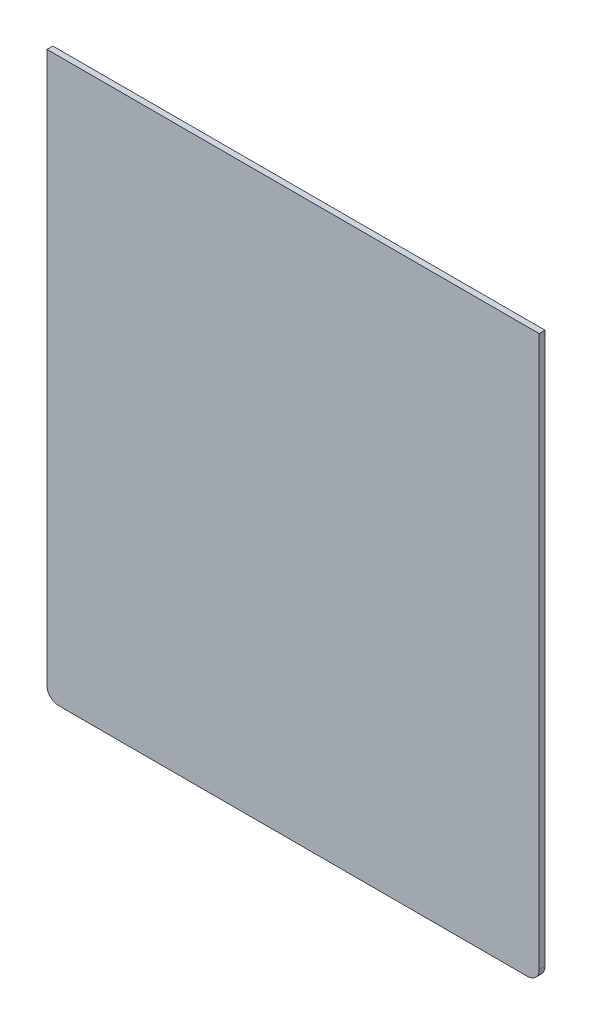
ISO-10303-21;
HEADER;
FILE_DESCRIPTION(('STEP AP214'),'2;1');
FILE_NAME('part.step','',(''),(''),'','','');
FILE_SCHEMA(('AUTOMOTIVE_DESIGN { 1 0 10303 214 1 1 1 1 }'));
ENDSEC;
DATA;
#1=APPLICATION_CONTEXT('core data for automotive mechanical design processes');
#2=APPLICATION_PROTOCOL_DEFINITION('international standard','automotive_design',2000,#1);
#3=PRODUCT_CONTEXT('',#1,'mechanical');
#4=PRODUCT('Part','Part','',(#3));
#5=PRODUCT_RELATED_PRODUCT_CATEGORY('part','',(#4));
#6=PRODUCT_DEFINITION_FORMATION('','',#4);
#7=PRODUCT_DEFINITION_CONTEXT('part definition',#1,'design');
#8=PRODUCT_DEFINITION('design','',#6,#7);
#9=PRODUCT_DEFINITION_SHAPE('','',#8);
#10=(LENGTH_UNIT() NAMED_UNIT(*) SI_UNIT(.MILLI.,.METRE.));
#11=(NAMED_UNIT(*) PLANE_ANGLE_UNIT() SI_UNIT($,.RADIAN.));
#12=(NAMED_UNIT(*) SI_UNIT($,.STERADIAN.) SOLID_ANGLE_UNIT());
#13=UNCERTAINTY_MEASURE_WITH_UNIT(LENGTH_MEASURE(1.E-05),#10,'distance_accuracy_value','');
#14=(GEOMETRIC_REPRESENTATION_CONTEXT(3) GLOBAL_UNCERTAINTY_ASSIGNED_CONTEXT((#13)) GLOBAL_UNIT_ASSIGNED_CONTEXT((#10,
#11,#12)) REPRESENTATION_CONTEXT('',''));
#15=CARTESIAN_POINT('',(0.,0.,0.));
#16=DIRECTION('',(0.,0.,1.));
#17=DIRECTION('',(1.,0.,0.));
#18=AXIS2_PLACEMENT_3D('',#15,#16,#17);
#19=CARTESIAN_POINT('',(210.,-240.,5.));
#20=DIRECTION('',(-1.,0.,0.));
#21=DIRECTION('',(0.,0.,1.));
#22=AXIS2_PLACEMENT_3D('',#19,#20,#21);
#23=PLANE('',#22);
#24=DIRECTION('',(0.,1.,0.));
#25=VECTOR('',#24,1.);
#26=CARTESIAN_POINT('',(210.,-240.,5.));
#27=LINE('',#26,#25);
#28=CARTESIAN_POINT('',(210.,-230.,5.));
#29=VERTEX_POINT('',#28);
#30=CARTESIAN_POINT('',(210.,240.,5.));
#31=VERTEX_POINT('',#30);
#32=EDGE_CURVE('E93',#29,#31,#27,.T.);
#33=ORIENTED_EDGE('',*,*,#32,.F.);
#34=DIRECTION('',(0.,0.,-1.));
#35=VECTOR('',#34,1.);
#36=CARTESIAN_POINT('',(210.,-230.,5.));
#37=LINE('',#36,#35);
#38=CARTESIAN_POINT('',(210.,-230.,0.));
#39=VERTEX_POINT('',#38);
#40=EDGE_CURVE('E11',#29,#39,#37,.T.);
#41=ORIENTED_EDGE('',*,*,#40,.T.);
#42=DIRECTION('',(0.,1.,0.));
#43=VECTOR('',#42,1.);
#44=CARTESIAN_POINT('',(210.,-240.,0.));
#45=LINE('',#44,#43);
#46=CARTESIAN_POINT('',(210.,240.,0.));
#47=VERTEX_POINT('',#46);
#48=EDGE_CURVE('E114',#39,#47,#45,.T.);
#49=ORIENTED_EDGE('',*,*,#48,.T.);
#50=DIRECTION('',(0.,0.,-1.));
#51=VECTOR('',#50,1.);
#52=CARTESIAN_POINT('',(210.,240.,5.));
#53=LINE('',#52,#51);
#54=EDGE_CURVE('E107',#31,#47,#53,.T.);
#55=ORIENTED_EDGE('',*,*,#54,.F.);
#56=EDGE_LOOP('',(#33,#41,#49,#55));
#57=FACE_BOUND('',#56,.T.);
#58=ADVANCED_FACE('F39',(#57),#23,.F.);
#59=CARTESIAN_POINT('',(-210.,240.,5.));
#60=DIRECTION('',(0.,-1.,0.));
#61=DIRECTION('',(0.,0.,-1.));
#62=AXIS2_PLACEMENT_3D('',#59,#60,#61);
#63=PLANE('',#62);
#64=DIRECTION('',(-1.,0.,0.));
#65=VECTOR('',#64,1.);
#66=CARTESIAN_POINT('',(-210.,240.,0.));
#67=LINE('',#66,#65);
#68=CARTESIAN_POINT('',(-210.,240.,0.));
#69=VERTEX_POINT('',#68);
#70=EDGE_CURVE('E158',#47,#69,#67,.T.);
#71=ORIENTED_EDGE('',*,*,#70,.T.);
#72=DIRECTION('',(0.,0.,-1.));
#73=VECTOR('',#72,1.);
#74=CARTESIAN_POINT('',(-210.,240.,5.));
#75=LINE('',#74,#73);
#76=CARTESIAN_POINT('',(-210.,240.,5.));
#77=VERTEX_POINT('',#76);
#78=EDGE_CURVE('E109',#77,#69,#75,.T.);
#79=ORIENTED_EDGE('',*,*,#78,.F.);
#80=DIRECTION('',(-1.,0.,0.));
#81=VECTOR('',#80,1.);
#82=CARTESIAN_POINT('',(-210.,240.,5.));
#83=LINE('',#82,#81);
#84=EDGE_CURVE('E96',#31,#77,#83,.T.);
#85=ORIENTED_EDGE('',*,*,#84,.F.);
#86=ORIENTED_EDGE('',*,*,#54,.T.);
#87=EDGE_LOOP('',(#71,#79,#85,#86));
#88=FACE_BOUND('',#87,.T.);
#89=ADVANCED_FACE('F106',(#88),#63,.F.);
#90=CARTESIAN_POINT('',(-210.,-240.,5.));
#91=DIRECTION('',(1.,0.,0.));
#92=DIRECTION('',(0.,0.,-1.));
#93=AXIS2_PLACEMENT_3D('',#90,#91,#92);
#94=PLANE('',#93);
#95=DIRECTION('',(0.,-1.,0.));
#96=VECTOR('',#95,1.);
#97=CARTESIAN_POINT('',(-210.,-240.,0.));
#98=LINE('',#97,#96);
#99=CARTESIAN_POINT('',(-210.,-230.,0.));
#100=VERTEX_POINT('',#99);
#101=EDGE_CURVE('E155',#69,#100,#98,.T.);
#102=ORIENTED_EDGE('',*,*,#101,.T.);
#103=DIRECTION('',(0.,0.,-1.));
#104=VECTOR('',#103,1.);
#105=CARTESIAN_POINT('',(-210.,-230.,5.));
#106=LINE('',#105,#104);
#107=CARTESIAN_POINT('',(-210.,-230.,5.));
#108=VERTEX_POINT('',#107);
#109=EDGE_CURVE('E63',#100,#108,#106,.F.);
#110=ORIENTED_EDGE('',*,*,#109,.T.);
#111=DIRECTION('',(0.,-1.,0.));
#112=VECTOR('',#111,1.);
#113=CARTESIAN_POINT('',(-210.,-240.,5.));
#114=LINE('',#113,#112);
#115=EDGE_CURVE('E111',#77,#108,#114,.T.);
#116=ORIENTED_EDGE('',*,*,#115,.F.);
#117=ORIENTED_EDGE('',*,*,#78,.T.);
#118=EDGE_LOOP('',(#102,#110,#116,#117));
#119=FACE_BOUND('',#118,.T.);
#120=ADVANCED_FACE('F156',(#119),#94,.F.);
#121=CARTESIAN_POINT('',(-210.,-240.,5.));
#122=DIRECTION('',(0.,1.,0.));
#123=DIRECTION('',(0.,0.,1.));
#124=AXIS2_PLACEMENT_3D('',#121,#122,#123);
#125=PLANE('',#124);
#126=DIRECTION('',(1.,0.,0.));
#127=VECTOR('',#126,1.);
#128=CARTESIAN_POINT('',(-210.,-240.,5.));
#129=LINE('',#128,#127);
#130=CARTESIAN_POINT('',(-200.,-240.,5.));
#131=VERTEX_POINT('',#130);
#132=CARTESIAN_POINT('',(200.,-240.,5.));
#133=VERTEX_POINT('',#132);
#134=EDGE_CURVE('E123',#131,#133,#129,.T.);
#135=ORIENTED_EDGE('',*,*,#134,.F.);
#136=DIRECTION('',(0.,0.,-1.));
#137=VECTOR('',#136,1.);
#138=CARTESIAN_POINT('',(-200.,-240.,5.));
#139=LINE('',#138,#137);
#140=CARTESIAN_POINT('',(-200.,-240.,0.));
#141=VERTEX_POINT('',#140);
#142=EDGE_CURVE('E121',#131,#141,#139,.T.);
#143=ORIENTED_EDGE('',*,*,#142,.T.);
#144=DIRECTION('',(1.,0.,0.));
#145=VECTOR('',#144,1.);
#146=CARTESIAN_POINT('',(-210.,-240.,0.));
#147=LINE('',#146,#145);
#148=CARTESIAN_POINT('',(200.,-240.,0.));
#149=VERTEX_POINT('',#148);
#150=EDGE_CURVE('E102',#141,#149,#147,.T.);
#151=ORIENTED_EDGE('',*,*,#150,.T.);
#152=DIRECTION('',(0.,0.,-1.));
#153=VECTOR('',#152,1.);
#154=CARTESIAN_POINT('',(200.,-240.,5.));
#155=LINE('',#154,#153);
#156=EDGE_CURVE('E117',#149,#133,#155,.F.);
#157=ORIENTED_EDGE('',*,*,#156,.T.);
#158=EDGE_LOOP('',(#135,#143,#151,#157));
#159=FACE_BOUND('',#158,.T.);
#160=ADVANCED_FACE('F145',(#159),#125,.F.);
#161=CARTESIAN_POINT('',(0.,0.,5.));
#162=DIRECTION('',(0.,0.,-1.));
#163=DIRECTION('',(-1.,0.,0.));
#164=AXIS2_PLACEMENT_3D('',#161,#162,#163);
#165=PLANE('',#164);
#166=ORIENTED_EDGE('',*,*,#115,.T.);
#167=CARTESIAN_POINT('',(-200.,-230.,5.));
#168=DIRECTION('',(0.,0.,-1.));
#169=DIRECTION('',(-1.,0.,0.));
#170=AXIS2_PLACEMENT_3D('',#167,#168,#169);
#171=CIRCLE('',#170,10.);
#172=EDGE_CURVE('E48',#108,#131,#171,.F.);
#173=ORIENTED_EDGE('',*,*,#172,.T.);
#174=ORIENTED_EDGE('',*,*,#134,.T.);
#175=CARTESIAN_POINT('',(200.,-230.,5.));
#176=DIRECTION('',(0.,0.,-1.));
#177=DIRECTION('',(-1.,0.,0.));
#178=AXIS2_PLACEMENT_3D('',#175,#176,#177);
#179=CIRCLE('',#178,10.);
#180=EDGE_CURVE('E55',#133,#29,#179,.F.);
#181=ORIENTED_EDGE('',*,*,#180,.T.);
#182=ORIENTED_EDGE('',*,*,#32,.T.);
#183=ORIENTED_EDGE('',*,*,#84,.T.);
#184=EDGE_LOOP('',(#166,#173,#174,#181,#182,#183));
#185=FACE_BOUND('',#184,.T.);
#186=ADVANCED_FACE('F95',(#185),#165,.F.);
#187=CARTESIAN_POINT('',(0.,0.,0.));
#188=DIRECTION('',(0.,0.,-1.));
#189=DIRECTION('',(-1.,0.,0.));
#190=AXIS2_PLACEMENT_3D('',#187,#188,#189);
#191=PLANE('',#190);
#192=ORIENTED_EDGE('',*,*,#150,.F.);
#193=CARTESIAN_POINT('',(-200.,-230.,0.));
#194=DIRECTION('',(0.,0.,-1.));
#195=DIRECTION('',(-1.,0.,0.));
#196=AXIS2_PLACEMENT_3D('',#193,#194,#195);
#197=CIRCLE('',#196,10.);
#198=EDGE_CURVE('E133',#141,#100,#197,.T.);
#199=ORIENTED_EDGE('',*,*,#198,.T.);
#200=ORIENTED_EDGE('',*,*,#101,.F.);
#201=ORIENTED_EDGE('',*,*,#70,.F.);
#202=ORIENTED_EDGE('',*,*,#48,.F.);
#203=CARTESIAN_POINT('',(200.,-230.,0.));
#204=DIRECTION('',(0.,0.,-1.));
#205=DIRECTION('',(-1.,0.,0.));
#206=AXIS2_PLACEMENT_3D('',#203,#204,#205);
#207=CIRCLE('',#206,10.);
#208=EDGE_CURVE('E130',#39,#149,#207,.T.);
#209=ORIENTED_EDGE('',*,*,#208,.T.);
#210=EDGE_LOOP('',(#192,#199,#200,#201,#202,#209));
#211=FACE_BOUND('',#210,.T.);
#212=ADVANCED_FACE('F154',(#211),#191,.T.);
#213=CARTESIAN_POINT('',(-200.,-230.,5.));
#214=DIRECTION('',(0.,0.,-1.));
#215=DIRECTION('',(-1.,0.,0.));
#216=AXIS2_PLACEMENT_3D('',#213,#214,#215);
#217=CYLINDRICAL_SURFACE('',#216,10.);
#218=ORIENTED_EDGE('',*,*,#172,.F.);
#219=ORIENTED_EDGE('',*,*,#109,.F.);
#220=ORIENTED_EDGE('',*,*,#198,.F.);
#221=ORIENTED_EDGE('',*,*,#142,.F.);
#222=EDGE_LOOP('',(#218,#219,#220,#221));
#223=FACE_BOUND('',#222,.T.);
#224=ADVANCED_FACE('F151',(#223),#217,.T.);
#225=CARTESIAN_POINT('',(200.,-230.,5.));
#226=DIRECTION('',(0.,0.,-1.));
#227=DIRECTION('',(-1.,0.,0.));
#228=AXIS2_PLACEMENT_3D('',#225,#226,#227);
#229=CYLINDRICAL_SURFACE('',#228,10.);
#230=ORIENTED_EDGE('',*,*,#180,.F.);
#231=ORIENTED_EDGE('',*,*,#156,.F.);
#232=ORIENTED_EDGE('',*,*,#208,.F.);
#233=ORIENTED_EDGE('',*,*,#40,.F.);
#234=EDGE_LOOP('',(#230,#231,#232,#233));
#235=FACE_BOUND('',#234,.T.);
#236=ADVANCED_FACE('F41',(#235),#229,.T.);
#237=CLOSED_SHELL('',(#58,#89,#120,#160,#186,#212,#224,#236));
#238=MANIFOLD_SOLID_BREP('B2',#237);
#239=ADVANCED_BREP_SHAPE_REPRESENTATION('',(#18,#238),#14);
#240=SHAPE_DEFINITION_REPRESENTATION(#9,#239);
ENDSEC;
END-ISO-10303-21;
